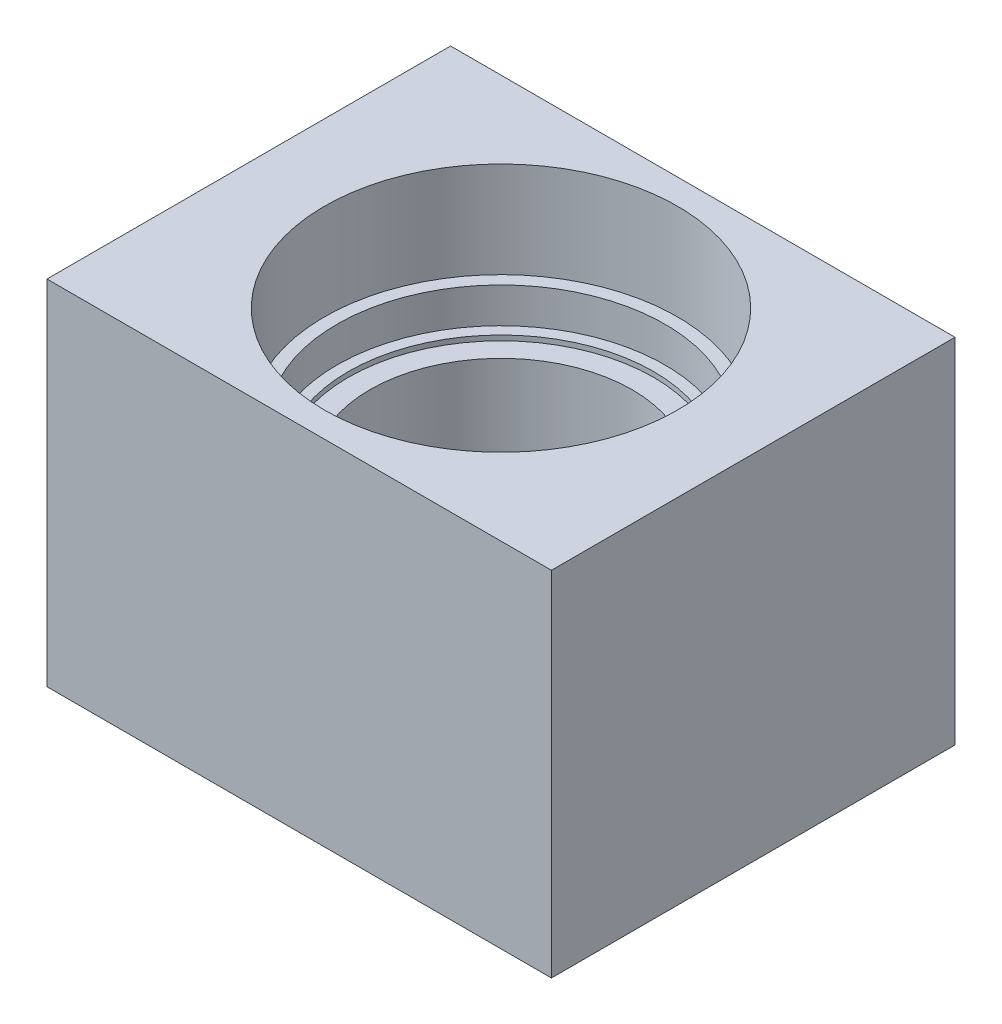
ISO-10303-21;
HEADER;
FILE_DESCRIPTION(('STEP AP214'),'2;1');
FILE_NAME('part.step','',(''),(''),'','','');
FILE_SCHEMA(('AUTOMOTIVE_DESIGN { 1 0 10303 214 1 1 1 1 }'));
ENDSEC;
DATA;
#1=APPLICATION_CONTEXT('core data for automotive mechanical design processes');
#2=APPLICATION_PROTOCOL_DEFINITION('international standard','automotive_design',2000,#1);
#3=PRODUCT_CONTEXT('',#1,'mechanical');
#4=PRODUCT('Part','Part','',(#3));
#5=PRODUCT_RELATED_PRODUCT_CATEGORY('part','',(#4));
#6=PRODUCT_DEFINITION_FORMATION('','',#4);
#7=PRODUCT_DEFINITION_CONTEXT('part definition',#1,'design');
#8=PRODUCT_DEFINITION('design','',#6,#7);
#9=PRODUCT_DEFINITION_SHAPE('','',#8);
#10=(LENGTH_UNIT() NAMED_UNIT(*) SI_UNIT(.MILLI.,.METRE.));
#11=(NAMED_UNIT(*) PLANE_ANGLE_UNIT() SI_UNIT($,.RADIAN.));
#12=(NAMED_UNIT(*) SI_UNIT($,.STERADIAN.) SOLID_ANGLE_UNIT());
#13=UNCERTAINTY_MEASURE_WITH_UNIT(LENGTH_MEASURE(1.E-05),#10,'distance_accuracy_value','');
#14=(GEOMETRIC_REPRESENTATION_CONTEXT(3) GLOBAL_UNCERTAINTY_ASSIGNED_CONTEXT((#13)) GLOBAL_UNIT_ASSIGNED_CONTEXT((#10,
#11,#12)) REPRESENTATION_CONTEXT('',''));
#15=CARTESIAN_POINT('',(0.,0.,0.));
#16=DIRECTION('',(0.,0.,1.));
#17=DIRECTION('',(1.,0.,0.));
#18=AXIS2_PLACEMENT_3D('',#15,#16,#17);
#19=CARTESIAN_POINT('',(0.,70.,0.));
#20=DIRECTION('',(0.,-1.,0.));
#21=DIRECTION('',(0.,0.,-1.));
#22=AXIS2_PLACEMENT_3D('',#19,#20,#21);
#23=CYLINDRICAL_SURFACE('',#22,26.);
#24=CARTESIAN_POINT('',(0.,43.,0.));
#25=DIRECTION('',(0.,1.,0.));
#26=DIRECTION('',(0.,0.,1.));
#27=AXIS2_PLACEMENT_3D('',#24,#25,#26);
#28=CIRCLE('',#27,26.);
#29=CARTESIAN_POINT('',(0.,43.,26.));
#30=VERTEX_POINT('',#29);
#31=EDGE_CURVE('E116',#30,#30,#28,.T.);
#32=ORIENTED_EDGE('',*,*,#31,.T.);
#33=EDGE_LOOP('',(#32));
#34=FACE_BOUND('',#33,.T.);
#35=CARTESIAN_POINT('',(0.,7.00000000000001,0.));
#36=DIRECTION('',(0.,-1.,0.));
#37=DIRECTION('',(0.,0.,-1.));
#38=AXIS2_PLACEMENT_3D('',#35,#36,#37);
#39=CIRCLE('',#38,26.);
#40=CARTESIAN_POINT('',(0.,7.00000000000001,-26.));
#41=VERTEX_POINT('',#40);
#42=EDGE_CURVE('E48',#41,#41,#39,.T.);
#43=ORIENTED_EDGE('',*,*,#42,.T.);
#44=EDGE_LOOP('',(#43));
#45=FACE_BOUND('',#44,.T.);
#46=ADVANCED_FACE('F44',(#34,#45),#23,.F.);
#47=CARTESIAN_POINT('',(0.,43.,0.));
#48=DIRECTION('',(0.,1.,0.));
#49=DIRECTION('',(0.,0.,1.));
#50=AXIS2_PLACEMENT_3D('',#47,#48,#49);
#51=CYLINDRICAL_SURFACE('',#50,32.5);
#52=CARTESIAN_POINT('',(0.,44.,0.));
#53=DIRECTION('',(0.,1.,0.));
#54=DIRECTION('',(0.,0.,1.));
#55=AXIS2_PLACEMENT_3D('',#52,#53,#54);
#56=CIRCLE('',#55,32.5);
#57=CARTESIAN_POINT('',(0.,44.,32.5));
#58=VERTEX_POINT('',#57);
#59=EDGE_CURVE('E124',#58,#58,#56,.T.);
#60=ORIENTED_EDGE('',*,*,#59,.F.);
#61=EDGE_LOOP('',(#60));
#62=FACE_BOUND('',#61,.T.);
#63=CARTESIAN_POINT('',(0.,51.,0.));
#64=DIRECTION('',(0.,1.,0.));
#65=DIRECTION('',(0.,0.,1.));
#66=AXIS2_PLACEMENT_3D('',#63,#64,#65);
#67=CIRCLE('',#66,32.5);
#68=CARTESIAN_POINT('',(0.,51.,32.5));
#69=VERTEX_POINT('',#68);
#70=EDGE_CURVE('E125',#69,#69,#67,.F.);
#71=ORIENTED_EDGE('',*,*,#70,.F.);
#72=EDGE_LOOP('',(#71));
#73=FACE_BOUND('',#72,.T.);
#74=ADVANCED_FACE('F147',(#62,#73),#51,.F.);
#75=CARTESIAN_POINT('',(0.,70.,0.));
#76=DIRECTION('',(0.,1.,0.));
#77=DIRECTION('',(0.,0.,1.));
#78=AXIS2_PLACEMENT_3D('',#75,#76,#77);
#79=PLANE('',#78);
#80=CARTESIAN_POINT('',(0.,70.,0.));
#81=DIRECTION('',(0.,1.,0.));
#82=DIRECTION('',(0.,0.,1.));
#83=AXIS2_PLACEMENT_3D('',#80,#81,#82);
#84=CIRCLE('',#83,35.);
#85=CARTESIAN_POINT('',(0.,70.,35.));
#86=VERTEX_POINT('',#85);
#87=EDGE_CURVE('E134',#86,#86,#84,.T.);
#88=ORIENTED_EDGE('',*,*,#87,.F.);
#89=EDGE_LOOP('',(#88));
#90=FACE_BOUND('',#89,.T.);
#91=DIRECTION('',(0.,0.,-1.));
#92=VECTOR('',#91,1.);
#93=CARTESIAN_POINT('',(50.,70.,-40.));
#94=LINE('',#93,#92);
#95=CARTESIAN_POINT('',(50.,70.,40.));
#96=VERTEX_POINT('',#95);
#97=CARTESIAN_POINT('',(50.,70.,-40.));
#98=VERTEX_POINT('',#97);
#99=EDGE_CURVE('E99',#96,#98,#94,.T.);
#100=ORIENTED_EDGE('',*,*,#99,.T.);
#101=DIRECTION('',(-1.,0.,0.));
#102=VECTOR('',#101,1.);
#103=CARTESIAN_POINT('',(-50.,70.,-40.));
#104=LINE('',#103,#102);
#105=CARTESIAN_POINT('',(-50.,70.,-40.));
#106=VERTEX_POINT('',#105);
#107=EDGE_CURVE('E94',#98,#106,#104,.T.);
#108=ORIENTED_EDGE('',*,*,#107,.T.);
#109=DIRECTION('',(0.,0.,1.));
#110=VECTOR('',#109,1.);
#111=CARTESIAN_POINT('',(-50.,70.,-40.));
#112=LINE('',#111,#110);
#113=CARTESIAN_POINT('',(-50.,70.,40.));
#114=VERTEX_POINT('',#113);
#115=EDGE_CURVE('E97',#106,#114,#112,.T.);
#116=ORIENTED_EDGE('',*,*,#115,.T.);
#117=DIRECTION('',(1.,0.,0.));
#118=VECTOR('',#117,1.);
#119=CARTESIAN_POINT('',(-50.,70.,40.));
#120=LINE('',#119,#118);
#121=EDGE_CURVE('E63',#114,#96,#120,.T.);
#122=ORIENTED_EDGE('',*,*,#121,.T.);
#123=EDGE_LOOP('',(#100,#108,#116,#122));
#124=FACE_BOUND('',#123,.T.);
#125=ADVANCED_FACE('F95',(#90,#124),#79,.T.);
#126=CARTESIAN_POINT('',(0.,0.,0.));
#127=DIRECTION('',(0.,1.,0.));
#128=DIRECTION('',(0.,0.,1.));
#129=AXIS2_PLACEMENT_3D('',#126,#127,#128);
#130=PLANE('',#129);
#131=CARTESIAN_POINT('',(0.,0.,0.));
#132=DIRECTION('',(0.,-1.,0.));
#133=DIRECTION('',(0.,0.,-1.));
#134=AXIS2_PLACEMENT_3D('',#131,#132,#133);
#135=CIRCLE('',#134,32.5);
#136=CARTESIAN_POINT('',(0.,0.,-32.5));
#137=VERTEX_POINT('',#136);
#138=EDGE_CURVE('E286',#137,#137,#135,.T.);
#139=ORIENTED_EDGE('',*,*,#138,.F.);
#140=EDGE_LOOP('',(#139));
#141=FACE_BOUND('',#140,.T.);
#142=DIRECTION('',(0.,0.,-1.));
#143=VECTOR('',#142,1.);
#144=CARTESIAN_POINT('',(50.,0.,-40.));
#145=LINE('',#144,#143);
#146=CARTESIAN_POINT('',(50.,0.,40.));
#147=VERTEX_POINT('',#146);
#148=CARTESIAN_POINT('',(50.,0.,-40.));
#149=VERTEX_POINT('',#148);
#150=EDGE_CURVE('E113',#147,#149,#145,.T.);
#151=ORIENTED_EDGE('',*,*,#150,.F.);
#152=DIRECTION('',(1.,0.,0.));
#153=VECTOR('',#152,1.);
#154=CARTESIAN_POINT('',(-50.,0.,40.));
#155=LINE('',#154,#153);
#156=CARTESIAN_POINT('',(-50.,0.,40.));
#157=VERTEX_POINT('',#156);
#158=EDGE_CURVE('E86',#157,#147,#155,.T.);
#159=ORIENTED_EDGE('',*,*,#158,.F.);
#160=DIRECTION('',(0.,0.,1.));
#161=VECTOR('',#160,1.);
#162=CARTESIAN_POINT('',(-50.,0.,-40.));
#163=LINE('',#162,#161);
#164=CARTESIAN_POINT('',(-50.,0.,-40.));
#165=VERTEX_POINT('',#164);
#166=EDGE_CURVE('E80',#165,#157,#163,.T.);
#167=ORIENTED_EDGE('',*,*,#166,.F.);
#168=DIRECTION('',(-1.,0.,0.));
#169=VECTOR('',#168,1.);
#170=CARTESIAN_POINT('',(-50.,0.,-40.));
#171=LINE('',#170,#169);
#172=EDGE_CURVE('E104',#149,#165,#171,.T.);
#173=ORIENTED_EDGE('',*,*,#172,.F.);
#174=EDGE_LOOP('',(#151,#159,#167,#173));
#175=FACE_BOUND('',#174,.T.);
#176=ADVANCED_FACE('F155',(#141,#175),#130,.F.);
#177=CARTESIAN_POINT('',(50.,70.,-40.));
#178=DIRECTION('',(-1.,0.,0.));
#179=DIRECTION('',(0.,0.,1.));
#180=AXIS2_PLACEMENT_3D('',#177,#178,#179);
#181=PLANE('',#180);
#182=ORIENTED_EDGE('',*,*,#150,.T.);
#183=DIRECTION('',(0.,-1.,0.));
#184=VECTOR('',#183,1.);
#185=CARTESIAN_POINT('',(50.,70.,-40.));
#186=LINE('',#185,#184);
#187=EDGE_CURVE('E54',#98,#149,#186,.T.);
#188=ORIENTED_EDGE('',*,*,#187,.F.);
#189=ORIENTED_EDGE('',*,*,#99,.F.);
#190=DIRECTION('',(0.,-1.,0.));
#191=VECTOR('',#190,1.);
#192=CARTESIAN_POINT('',(50.,70.,40.));
#193=LINE('',#192,#191);
#194=EDGE_CURVE('E109',#96,#147,#193,.T.);
#195=ORIENTED_EDGE('',*,*,#194,.T.);
#196=EDGE_LOOP('',(#182,#188,#189,#195));
#197=FACE_BOUND('',#196,.T.);
#198=ADVANCED_FACE('F46',(#197),#181,.F.);
#199=CARTESIAN_POINT('',(-50.,70.,-40.));
#200=DIRECTION('',(0.,0.,1.));
#201=DIRECTION('',(1.,0.,0.));
#202=AXIS2_PLACEMENT_3D('',#199,#200,#201);
#203=PLANE('',#202);
#204=ORIENTED_EDGE('',*,*,#172,.T.);
#205=DIRECTION('',(0.,-1.,0.));
#206=VECTOR('',#205,1.);
#207=CARTESIAN_POINT('',(-50.,70.,-40.));
#208=LINE('',#207,#206);
#209=EDGE_CURVE('E102',#106,#165,#208,.T.);
#210=ORIENTED_EDGE('',*,*,#209,.F.);
#211=ORIENTED_EDGE('',*,*,#107,.F.);
#212=ORIENTED_EDGE('',*,*,#187,.T.);
#213=EDGE_LOOP('',(#204,#210,#211,#212));
#214=FACE_BOUND('',#213,.T.);
#215=ADVANCED_FACE('F103',(#214),#203,.F.);
#216=CARTESIAN_POINT('',(-50.,70.,-40.));
#217=DIRECTION('',(1.,0.,0.));
#218=DIRECTION('',(0.,0.,-1.));
#219=AXIS2_PLACEMENT_3D('',#216,#217,#218);
#220=PLANE('',#219);
#221=ORIENTED_EDGE('',*,*,#166,.T.);
#222=DIRECTION('',(0.,-1.,0.));
#223=VECTOR('',#222,1.);
#224=CARTESIAN_POINT('',(-50.,70.,40.));
#225=LINE('',#224,#223);
#226=EDGE_CURVE('E105',#114,#157,#225,.T.);
#227=ORIENTED_EDGE('',*,*,#226,.F.);
#228=ORIENTED_EDGE('',*,*,#115,.F.);
#229=ORIENTED_EDGE('',*,*,#209,.T.);
#230=EDGE_LOOP('',(#221,#227,#228,#229));
#231=FACE_BOUND('',#230,.T.);
#232=ADVANCED_FACE('F107',(#231),#220,.F.);
#233=CARTESIAN_POINT('',(-50.,70.,40.));
#234=DIRECTION('',(0.,0.,-1.));
#235=DIRECTION('',(-1.,0.,0.));
#236=AXIS2_PLACEMENT_3D('',#233,#234,#235);
#237=PLANE('',#236);
#238=ORIENTED_EDGE('',*,*,#158,.T.);
#239=ORIENTED_EDGE('',*,*,#194,.F.);
#240=ORIENTED_EDGE('',*,*,#121,.F.);
#241=ORIENTED_EDGE('',*,*,#226,.T.);
#242=EDGE_LOOP('',(#238,#239,#240,#241));
#243=FACE_BOUND('',#242,.T.);
#244=ADVANCED_FACE('F168',(#243),#237,.F.);
#245=CARTESIAN_POINT('',(0.,43.,0.));
#246=DIRECTION('',(0.,1.,0.));
#247=DIRECTION('',(0.,0.,1.));
#248=AXIS2_PLACEMENT_3D('',#245,#246,#247);
#249=PLANE('',#248);
#250=CARTESIAN_POINT('',(0.,43.,0.));
#251=DIRECTION('',(0.,1.,0.));
#252=DIRECTION('',(0.,0.,1.));
#253=AXIS2_PLACEMENT_3D('',#250,#251,#252);
#254=CIRCLE('',#253,30.25);
#255=CARTESIAN_POINT('',(0.,43.,30.25));
#256=VERTEX_POINT('',#255);
#257=EDGE_CURVE('E13',#256,#256,#254,.F.);
#258=ORIENTED_EDGE('',*,*,#257,.F.);
#259=EDGE_LOOP('',(#258));
#260=FACE_BOUND('',#259,.T.);
#261=ORIENTED_EDGE('',*,*,#31,.F.);
#262=EDGE_LOOP('',(#261));
#263=FACE_BOUND('',#262,.T.);
#264=ADVANCED_FACE('F162',(#260,#263),#249,.T.);
#265=CARTESIAN_POINT('',(0.,44.,0.));
#266=DIRECTION('',(0.,-1.,0.));
#267=DIRECTION('',(0.,0.,-1.));
#268=AXIS2_PLACEMENT_3D('',#265,#266,#267);
#269=CYLINDRICAL_SURFACE('',#268,30.25);
#270=CARTESIAN_POINT('',(0.,44.,0.));
#271=DIRECTION('',(0.,1.,0.));
#272=DIRECTION('',(0.,0.,1.));
#273=AXIS2_PLACEMENT_3D('',#270,#271,#272);
#274=CIRCLE('',#273,30.25);
#275=CARTESIAN_POINT('',(0.,44.,30.25));
#276=VERTEX_POINT('',#275);
#277=EDGE_CURVE('E127',#276,#276,#274,.T.);
#278=ORIENTED_EDGE('',*,*,#277,.T.);
#279=EDGE_LOOP('',(#278));
#280=FACE_BOUND('',#279,.T.);
#281=ORIENTED_EDGE('',*,*,#257,.T.);
#282=EDGE_LOOP('',(#281));
#283=FACE_BOUND('',#282,.T.);
#284=ADVANCED_FACE('F212',(#280,#283),#269,.F.);
#285=CARTESIAN_POINT('',(0.,44.,0.));
#286=DIRECTION('',(0.,1.,0.));
#287=DIRECTION('',(0.,0.,1.));
#288=AXIS2_PLACEMENT_3D('',#285,#286,#287);
#289=PLANE('',#288);
#290=ORIENTED_EDGE('',*,*,#277,.F.);
#291=EDGE_LOOP('',(#290));
#292=FACE_BOUND('',#291,.T.);
#293=ORIENTED_EDGE('',*,*,#59,.T.);
#294=EDGE_LOOP('',(#293));
#295=FACE_BOUND('',#294,.T.);
#296=ADVANCED_FACE('F145',(#292,#295),#289,.T.);
#297=CARTESIAN_POINT('',(0.,51.,0.));
#298=DIRECTION('',(0.,1.,0.));
#299=DIRECTION('',(0.,0.,1.));
#300=AXIS2_PLACEMENT_3D('',#297,#298,#299);
#301=PLANE('',#300);
#302=CARTESIAN_POINT('',(0.,51.,0.));
#303=DIRECTION('',(0.,1.,0.));
#304=DIRECTION('',(0.,0.,1.));
#305=AXIS2_PLACEMENT_3D('',#302,#303,#304);
#306=CIRCLE('',#305,35.);
#307=CARTESIAN_POINT('',(0.,51.,35.));
#308=VERTEX_POINT('',#307);
#309=EDGE_CURVE('E128',#308,#308,#306,.F.);
#310=ORIENTED_EDGE('',*,*,#309,.F.);
#311=EDGE_LOOP('',(#310));
#312=FACE_BOUND('',#311,.T.);
#313=ORIENTED_EDGE('',*,*,#70,.T.);
#314=EDGE_LOOP('',(#313));
#315=FACE_BOUND('',#314,.T.);
#316=ADVANCED_FACE('F228',(#312,#315),#301,.T.);
#317=CARTESIAN_POINT('',(0.,-54.9949493661167,0.));
#318=DIRECTION('',(0.,1.,0.));
#319=DIRECTION('',(0.,0.,1.));
#320=AXIS2_PLACEMENT_3D('',#317,#318,#319);
#321=CYLINDRICAL_SURFACE('',#320,35.);
#322=ORIENTED_EDGE('',*,*,#309,.T.);
#323=EDGE_LOOP('',(#322));
#324=FACE_BOUND('',#323,.T.);
#325=ORIENTED_EDGE('',*,*,#87,.T.);
#326=EDGE_LOOP('',(#325));
#327=FACE_BOUND('',#326,.T.);
#328=ADVANCED_FACE('F242',(#324,#327),#321,.F.);
#329=CARTESIAN_POINT('',(0.,7.,0.));
#330=DIRECTION('',(0.,-1.,0.));
#331=DIRECTION('',(0.,0.,-1.));
#332=AXIS2_PLACEMENT_3D('',#329,#330,#331);
#333=CYLINDRICAL_SURFACE('',#332,32.5);
#334=CARTESIAN_POINT('',(0.,7.,0.));
#335=DIRECTION('',(0.,-1.,0.));
#336=DIRECTION('',(0.,0.,-1.));
#337=AXIS2_PLACEMENT_3D('',#334,#335,#336);
#338=CIRCLE('',#337,32.5);
#339=CARTESIAN_POINT('',(0.,7.,-32.5));
#340=VERTEX_POINT('',#339);
#341=EDGE_CURVE('E285',#340,#340,#338,.T.);
#342=ORIENTED_EDGE('',*,*,#341,.F.);
#343=EDGE_LOOP('',(#342));
#344=FACE_BOUND('',#343,.T.);
#345=ORIENTED_EDGE('',*,*,#138,.T.);
#346=EDGE_LOOP('',(#345));
#347=FACE_BOUND('',#346,.T.);
#348=ADVANCED_FACE('F252',(#344,#347),#333,.F.);
#349=CARTESIAN_POINT('',(0.,7.,0.));
#350=DIRECTION('',(0.,-1.,0.));
#351=DIRECTION('',(0.,0.,-1.));
#352=AXIS2_PLACEMENT_3D('',#349,#350,#351);
#353=PLANE('',#352);
#354=ORIENTED_EDGE('',*,*,#42,.F.);
#355=EDGE_LOOP('',(#354));
#356=FACE_BOUND('',#355,.T.);
#357=ORIENTED_EDGE('',*,*,#341,.T.);
#358=EDGE_LOOP('',(#357));
#359=FACE_BOUND('',#358,.T.);
#360=ADVANCED_FACE('F267',(#356,#359),#353,.T.);
#361=CLOSED_SHELL('',(#46,#74,#125,#176,#198,#215,#232,#244,#264,#284,#296,#316,#328,#348,#360));
#362=MANIFOLD_SOLID_BREP('B2',#361);
#363=ADVANCED_BREP_SHAPE_REPRESENTATION('',(#18,#362),#14);
#364=SHAPE_DEFINITION_REPRESENTATION(#9,#363);
ENDSEC;
END-ISO-10303-21;
